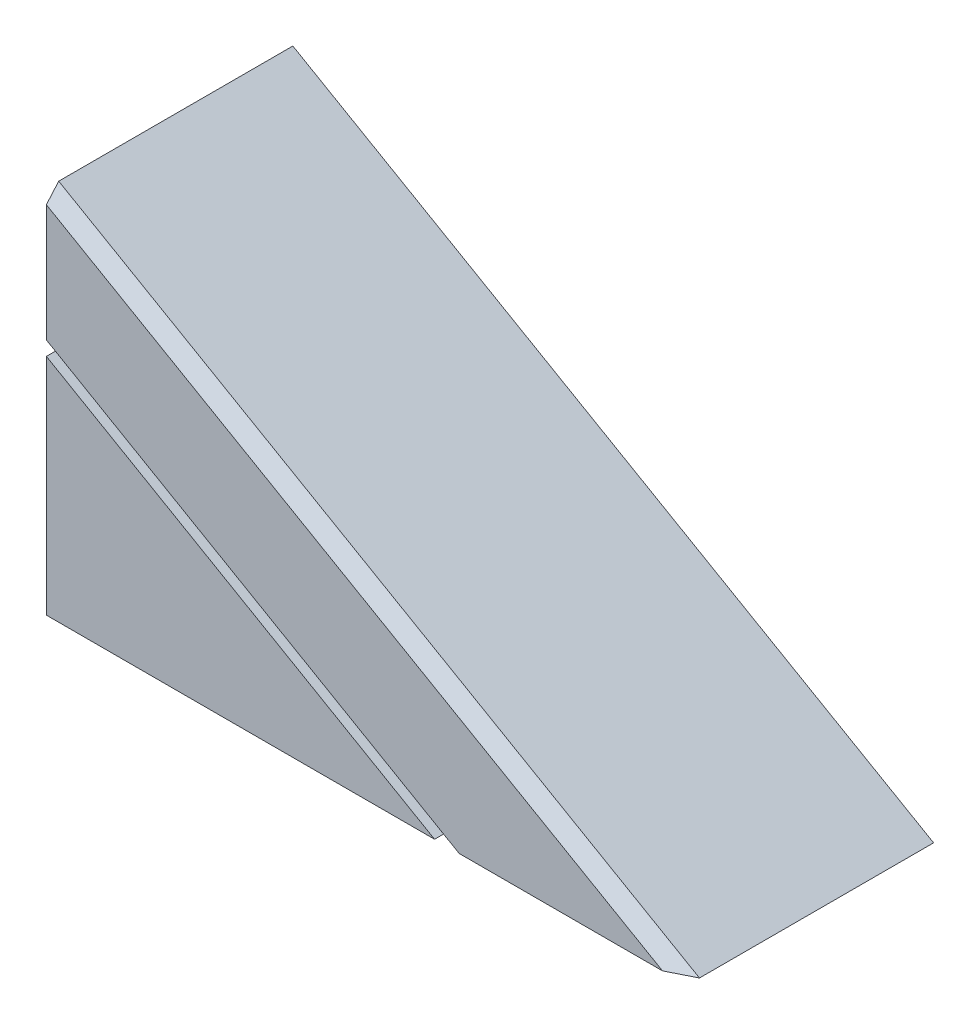
ISO-10303-21;
HEADER;
FILE_DESCRIPTION(('STEP AP214'),'2;1');
FILE_NAME('part.step','',(''),(''),'','','');
FILE_SCHEMA(('AUTOMOTIVE_DESIGN { 1 0 10303 214 1 1 1 1 }'));
ENDSEC;
DATA;
#1=APPLICATION_CONTEXT('core data for automotive mechanical design processes');
#2=APPLICATION_PROTOCOL_DEFINITION('international standard','automotive_design',2000,#1);
#3=PRODUCT_CONTEXT('',#1,'mechanical');
#4=PRODUCT('Part','Part','',(#3));
#5=PRODUCT_RELATED_PRODUCT_CATEGORY('part','',(#4));
#6=PRODUCT_DEFINITION_FORMATION('','',#4);
#7=PRODUCT_DEFINITION_CONTEXT('part definition',#1,'design');
#8=PRODUCT_DEFINITION('design','',#6,#7);
#9=PRODUCT_DEFINITION_SHAPE('','',#8);
#10=(LENGTH_UNIT() NAMED_UNIT(*) SI_UNIT(.MILLI.,.METRE.));
#11=(NAMED_UNIT(*) PLANE_ANGLE_UNIT() SI_UNIT($,.RADIAN.));
#12=(NAMED_UNIT(*) SI_UNIT($,.STERADIAN.) SOLID_ANGLE_UNIT());
#13=UNCERTAINTY_MEASURE_WITH_UNIT(LENGTH_MEASURE(1.E-05),#10,'distance_accuracy_value','');
#14=(GEOMETRIC_REPRESENTATION_CONTEXT(3) GLOBAL_UNCERTAINTY_ASSIGNED_CONTEXT((#13)) GLOBAL_UNIT_ASSIGNED_CONTEXT((#10,
#11,#12)) REPRESENTATION_CONTEXT('',''));
#15=CARTESIAN_POINT('',(0.,0.,0.));
#16=DIRECTION('',(0.,0.,1.));
#17=DIRECTION('',(1.,0.,0.));
#18=AXIS2_PLACEMENT_3D('',#15,#16,#17);
#19=CARTESIAN_POINT('',(0.,6.,4.));
#20=DIRECTION('',(1.,0.,0.));
#21=DIRECTION('',(0.,1.,0.));
#22=AXIS2_PLACEMENT_3D('',#19,#20,#21);
#23=PLANE('',#22);
#24=DIRECTION('',(0.,-1.,0.));
#25=VECTOR('',#24,1.);
#26=CARTESIAN_POINT('',(0.,6.,4.));
#27=LINE('',#26,#25);
#28=CARTESIAN_POINT('',(0.,5.76910259969533,4.));
#29=VERTEX_POINT('',#28);
#30=CARTESIAN_POINT('',(0.,3.86836027713626,4.));
#31=VERTEX_POINT('',#30);
#32=EDGE_CURVE('E132',#29,#31,#27,.T.);
#33=ORIENTED_EDGE('',*,*,#32,.F.);
#34=DIRECTION('',(0.,0.755869025369477,-0.65472285471564));
#35=VECTOR('',#34,1.);
#36=CARTESIAN_POINT('',(0.,4.94599030741159,4.71296800327559));
#37=LINE('',#36,#35);
#38=CARTESIAN_POINT('',(0.,6.,3.8));
#39=VERTEX_POINT('',#38);
#40=EDGE_CURVE('E55',#29,#39,#37,.T.);
#41=ORIENTED_EDGE('',*,*,#40,.T.);
#42=DIRECTION('',(0.,0.,-1.));
#43=VECTOR('',#42,1.);
#44=CARTESIAN_POINT('',(0.,6.,4.));
#45=LINE('',#44,#43);
#46=CARTESIAN_POINT('',(0.,6.,0.));
#47=VERTEX_POINT('',#46);
#48=EDGE_CURVE('E138',#39,#47,#45,.T.);
#49=ORIENTED_EDGE('',*,*,#48,.T.);
#50=DIRECTION('',(0.,-1.,0.));
#51=VECTOR('',#50,1.);
#52=CARTESIAN_POINT('',(0.,6.,0.));
#53=LINE('',#52,#51);
#54=CARTESIAN_POINT('',(0.,0.,0.));
#55=VERTEX_POINT('',#54);
#56=EDGE_CURVE('E139',#47,#55,#53,.T.);
#57=ORIENTED_EDGE('',*,*,#56,.T.);
#58=DIRECTION('',(0.,0.,-1.));
#59=VECTOR('',#58,1.);
#60=CARTESIAN_POINT('',(0.,0.,4.));
#61=LINE('',#60,#59);
#62=CARTESIAN_POINT('',(0.,0.,4.));
#63=VERTEX_POINT('',#62);
#64=EDGE_CURVE('E152',#63,#55,#61,.T.);
#65=ORIENTED_EDGE('',*,*,#64,.F.);
#66=CARTESIAN_POINT('',(0.,3.63741339491917,4.));
#67=VERTEX_POINT('',#66);
#68=EDGE_CURVE('E135',#67,#63,#27,.T.);
#69=ORIENTED_EDGE('',*,*,#68,.F.);
#70=DIRECTION('',(0.,0.,-1.));
#71=VECTOR('',#70,1.);
#72=CARTESIAN_POINT('',(0.,3.63741339491917,4.));
#73=LINE('',#72,#71);
#74=CARTESIAN_POINT('',(0.,3.63741339491917,2.));
#75=VERTEX_POINT('',#74);
#76=EDGE_CURVE('E107',#67,#75,#73,.T.);
#77=ORIENTED_EDGE('',*,*,#76,.T.);
#78=DIRECTION('',(0.,1.,0.));
#79=VECTOR('',#78,1.);
#80=CARTESIAN_POINT('',(0.,-1.01522511669733,2.));
#81=LINE('',#80,#79);
#82=CARTESIAN_POINT('',(0.,3.86836027713626,2.));
#83=VERTEX_POINT('',#82);
#84=EDGE_CURVE('E115',#75,#83,#81,.T.);
#85=ORIENTED_EDGE('',*,*,#84,.T.);
#86=DIRECTION('',(0.,0.,1.));
#87=VECTOR('',#86,1.);
#88=CARTESIAN_POINT('',(0.,3.86836027713626,4.));
#89=LINE('',#88,#87);
#90=EDGE_CURVE('E143',#83,#31,#89,.T.);
#91=ORIENTED_EDGE('',*,*,#90,.T.);
#92=EDGE_LOOP('',(#33,#41,#49,#57,#65,#69,#77,#85,#91));
#93=FACE_BOUND('',#92,.T.);
#94=ADVANCED_FACE('F33',(#93),#23,.F.);
#95=CARTESIAN_POINT('',(0.,0.,4.));
#96=DIRECTION('',(0.,1.,0.));
#97=DIRECTION('',(0.,0.,1.));
#98=AXIS2_PLACEMENT_3D('',#95,#96,#97);
#99=PLANE('',#98);
#100=DIRECTION('',(0.,0.,-1.));
#101=VECTOR('',#100,1.);
#102=CARTESIAN_POINT('',(10.4,0.,4.));
#103=LINE('',#102,#101);
#104=CARTESIAN_POINT('',(10.4,0.,3.8));
#105=VERTEX_POINT('',#104);
#106=CARTESIAN_POINT('',(10.4,0.,0.));
#107=VERTEX_POINT('',#106);
#108=EDGE_CURVE('E150',#105,#107,#103,.T.);
#109=ORIENTED_EDGE('',*,*,#108,.F.);
#110=DIRECTION('',(-0.894526478028141,0.,0.44701496631161));
#111=VECTOR('',#110,1.);
#112=CARTESIAN_POINT('',(3.99635881684044,0.,7.00004328331537));
#113=LINE('',#112,#111);
#114=CARTESIAN_POINT('',(9.9997778394719,0.,4.));
#115=VERTEX_POINT('',#114);
#116=EDGE_CURVE('E11',#105,#115,#113,.T.);
#117=ORIENTED_EDGE('',*,*,#116,.T.);
#118=DIRECTION('',(1.,0.,0.));
#119=VECTOR('',#118,1.);
#120=CARTESIAN_POINT('',(0.,0.,4.));
#121=LINE('',#120,#119);
#122=CARTESIAN_POINT('',(6.7,0.,4.));
#123=VERTEX_POINT('',#122);
#124=EDGE_CURVE('E134',#123,#115,#121,.T.);
#125=ORIENTED_EDGE('',*,*,#124,.F.);
#126=DIRECTION('',(0.,0.,-1.));
#127=VECTOR('',#126,1.);
#128=CARTESIAN_POINT('',(6.7,0.,4.));
#129=LINE('',#128,#127);
#130=CARTESIAN_POINT('',(6.7,0.,2.));
#131=VERTEX_POINT('',#130);
#132=EDGE_CURVE('E121',#123,#131,#129,.T.);
#133=ORIENTED_EDGE('',*,*,#132,.T.);
#134=DIRECTION('',(-1.,0.,0.));
#135=VECTOR('',#134,1.);
#136=CARTESIAN_POINT('',(8.05836990211978,0.,2.));
#137=LINE('',#136,#135);
#138=CARTESIAN_POINT('',(6.30000000000001,0.,2.));
#139=VERTEX_POINT('',#138);
#140=EDGE_CURVE('E108',#131,#139,#137,.T.);
#141=ORIENTED_EDGE('',*,*,#140,.T.);
#142=DIRECTION('',(0.,0.,1.));
#143=VECTOR('',#142,1.);
#144=CARTESIAN_POINT('',(6.3,0.,4.));
#145=LINE('',#144,#143);
#146=CARTESIAN_POINT('',(6.30000000000001,0.,4.));
#147=VERTEX_POINT('',#146);
#148=EDGE_CURVE('E96',#139,#147,#145,.T.);
#149=ORIENTED_EDGE('',*,*,#148,.T.);
#150=EDGE_CURVE('E136',#63,#147,#121,.T.);
#151=ORIENTED_EDGE('',*,*,#150,.F.);
#152=ORIENTED_EDGE('',*,*,#64,.T.);
#153=DIRECTION('',(1.,0.,0.));
#154=VECTOR('',#153,1.);
#155=CARTESIAN_POINT('',(0.,0.,0.));
#156=LINE('',#155,#154);
#157=EDGE_CURVE('E142',#55,#107,#156,.T.);
#158=ORIENTED_EDGE('',*,*,#157,.T.);
#159=EDGE_LOOP('',(#109,#117,#125,#133,#141,#149,#151,#152,#158));
#160=FACE_BOUND('',#159,.T.);
#161=ADVANCED_FACE('F119',(#160),#99,.F.);
#162=CARTESIAN_POINT('',(0.,0.,4.));
#163=DIRECTION('',(0.,0.,1.));
#164=DIRECTION('',(1.,0.,0.));
#165=AXIS2_PLACEMENT_3D('',#162,#163,#164);
#166=PLANE('',#165);
#167=ORIENTED_EDGE('',*,*,#150,.T.);
#168=DIRECTION('',(-0.866019052628739,0.500011000363013,0.));
#169=VECTOR('',#168,1.);
#170=CARTESIAN_POINT('',(8.05836990211978,-1.01522511669733,4.));
#171=LINE('',#170,#169);
#172=EDGE_CURVE('E102',#147,#67,#171,.T.);
#173=ORIENTED_EDGE('',*,*,#172,.T.);
#174=ORIENTED_EDGE('',*,*,#68,.T.);
#175=EDGE_LOOP('',(#167,#173,#174));
#176=FACE_BOUND('',#175,.T.);
#177=ADVANCED_FACE('F178',(#176),#166,.T.);
#178=ORIENTED_EDGE('',*,*,#124,.T.);
#179=DIRECTION('',(-0.866185586048601,0.499722453489577,0.));
#180=VECTOR('',#179,1.);
#181=CARTESIAN_POINT('',(-0.0999444906979154,5.82676288279028,4.));
#182=LINE('',#181,#180);
#183=EDGE_CURVE('E155',#115,#29,#182,.T.);
#184=ORIENTED_EDGE('',*,*,#183,.T.);
#185=ORIENTED_EDGE('',*,*,#32,.T.);
#186=DIRECTION('',(-0.866019052628739,0.500011000363013,0.));
#187=VECTOR('',#186,1.);
#188=CARTESIAN_POINT('',(8.45836990211978,-1.01522511669733,4.));
#189=LINE('',#188,#187);
#190=EDGE_CURVE('E123',#123,#31,#189,.T.);
#191=ORIENTED_EDGE('',*,*,#190,.F.);
#192=EDGE_LOOP('',(#178,#184,#185,#191));
#193=FACE_BOUND('',#192,.T.);
#194=ADVANCED_FACE('F161',(#193),#166,.T.);
#195=CARTESIAN_POINT('',(10.4,0.,4.));
#196=DIRECTION('',(-0.499722453489577,-0.8661855860486,0.));
#197=DIRECTION('',(0.8661855860486,-0.499722453489577,0.));
#198=AXIS2_PLACEMENT_3D('',#195,#196,#197);
#199=PLANE('',#198);
#200=ORIENTED_EDGE('',*,*,#48,.F.);
#201=DIRECTION('',(0.8661855860486,-0.499722453489577,0.));
#202=VECTOR('',#201,1.);
#203=CARTESIAN_POINT('',(10.4,0.,3.8));
#204=LINE('',#203,#202);
#205=EDGE_CURVE('E41',#39,#105,#204,.T.);
#206=ORIENTED_EDGE('',*,*,#205,.T.);
#207=ORIENTED_EDGE('',*,*,#108,.T.);
#208=DIRECTION('',(-0.8661855860486,0.499722453489577,0.));
#209=VECTOR('',#208,1.);
#210=CARTESIAN_POINT('',(10.4,0.,0.));
#211=LINE('',#210,#209);
#212=EDGE_CURVE('E146',#107,#47,#211,.T.);
#213=ORIENTED_EDGE('',*,*,#212,.T.);
#214=EDGE_LOOP('',(#200,#206,#207,#213));
#215=FACE_BOUND('',#214,.T.);
#216=ADVANCED_FACE('F181',(#215),#199,.F.);
#217=CARTESIAN_POINT('',(0.,0.,0.));
#218=DIRECTION('',(0.,0.,1.));
#219=DIRECTION('',(1.,0.,0.));
#220=AXIS2_PLACEMENT_3D('',#217,#218,#219);
#221=PLANE('',#220);
#222=ORIENTED_EDGE('',*,*,#56,.F.);
#223=ORIENTED_EDGE('',*,*,#212,.F.);
#224=ORIENTED_EDGE('',*,*,#157,.F.);
#225=EDGE_LOOP('',(#222,#223,#224));
#226=FACE_BOUND('',#225,.T.);
#227=ADVANCED_FACE('F184',(#226),#221,.F.);
#228=CARTESIAN_POINT('',(8.05836990211978,-1.01522511669733,4.));
#229=DIRECTION('',(0.500011000363013,0.866019052628739,0.));
#230=DIRECTION('',(-0.866019052628739,0.500011000363014,0.));
#231=AXIS2_PLACEMENT_3D('',#228,#229,#230);
#232=PLANE('',#231);
#233=ORIENTED_EDGE('',*,*,#172,.F.);
#234=ORIENTED_EDGE('',*,*,#148,.F.);
#235=DIRECTION('',(-0.866019052628739,0.500011000363013,0.));
#236=VECTOR('',#235,1.);
#237=CARTESIAN_POINT('',(8.05836990211978,-1.01522511669733,2.));
#238=LINE('',#237,#236);
#239=EDGE_CURVE('E99',#139,#75,#238,.T.);
#240=ORIENTED_EDGE('',*,*,#239,.T.);
#241=ORIENTED_EDGE('',*,*,#76,.F.);
#242=EDGE_LOOP('',(#233,#234,#240,#241));
#243=FACE_BOUND('',#242,.T.);
#244=ADVANCED_FACE('F98',(#243),#232,.T.);
#245=CARTESIAN_POINT('',(8.05836990211978,-1.01522511669733,2.));
#246=DIRECTION('',(0.,0.,1.));
#247=DIRECTION('',(1.,0.,0.));
#248=AXIS2_PLACEMENT_3D('',#245,#246,#247);
#249=PLANE('',#248);
#250=ORIENTED_EDGE('',*,*,#239,.F.);
#251=ORIENTED_EDGE('',*,*,#140,.F.);
#252=DIRECTION('',(-0.866019052628739,0.500011000363013,0.));
#253=VECTOR('',#252,1.);
#254=CARTESIAN_POINT('',(8.45836990211978,-1.01522511669733,2.));
#255=LINE('',#254,#253);
#256=EDGE_CURVE('E116',#131,#83,#255,.T.);
#257=ORIENTED_EDGE('',*,*,#256,.T.);
#258=ORIENTED_EDGE('',*,*,#84,.F.);
#259=EDGE_LOOP('',(#250,#251,#257,#258));
#260=FACE_BOUND('',#259,.T.);
#261=ADVANCED_FACE('F111',(#260),#249,.T.);
#262=CARTESIAN_POINT('',(8.45836990211978,-1.01522511669733,4.));
#263=DIRECTION('',(-0.500011000363013,-0.866019052628739,0.));
#264=DIRECTION('',(0.866019052628739,-0.500011000363014,0.));
#265=AXIS2_PLACEMENT_3D('',#262,#263,#264);
#266=PLANE('',#265);
#267=ORIENTED_EDGE('',*,*,#256,.F.);
#268=ORIENTED_EDGE('',*,*,#132,.F.);
#269=ORIENTED_EDGE('',*,*,#190,.T.);
#270=ORIENTED_EDGE('',*,*,#90,.F.);
#271=EDGE_LOOP('',(#267,#268,#269,#270));
#272=FACE_BOUND('',#271,.T.);
#273=ADVANCED_FACE('F168',(#272),#266,.T.);
#274=CARTESIAN_POINT('',(2.49716982672717,4.32842769966042,4.));
#275=DIRECTION('',(0.353357135573658,0.612485701661007,0.70710678118655));
#276=DIRECTION('',(0.8661855860486,-0.499722453489577,0.));
#277=AXIS2_PLACEMENT_3D('',#274,#275,#276);
#278=PLANE('',#277);
#279=ORIENTED_EDGE('',*,*,#116,.F.);
#280=ORIENTED_EDGE('',*,*,#205,.F.);
#281=ORIENTED_EDGE('',*,*,#40,.F.);
#282=ORIENTED_EDGE('',*,*,#183,.F.);
#283=EDGE_LOOP('',(#279,#280,#281,#282));
#284=FACE_BOUND('',#283,.T.);
#285=ADVANCED_FACE('F35',(#284),#278,.T.);
#286=CLOSED_SHELL('',(#94,#161,#177,#194,#216,#227,#244,#261,#273,#285));
#287=MANIFOLD_SOLID_BREP('B2',#286);
#288=ADVANCED_BREP_SHAPE_REPRESENTATION('',(#18,#287),#14);
#289=SHAPE_DEFINITION_REPRESENTATION(#9,#288);
ENDSEC;
END-ISO-10303-21;
